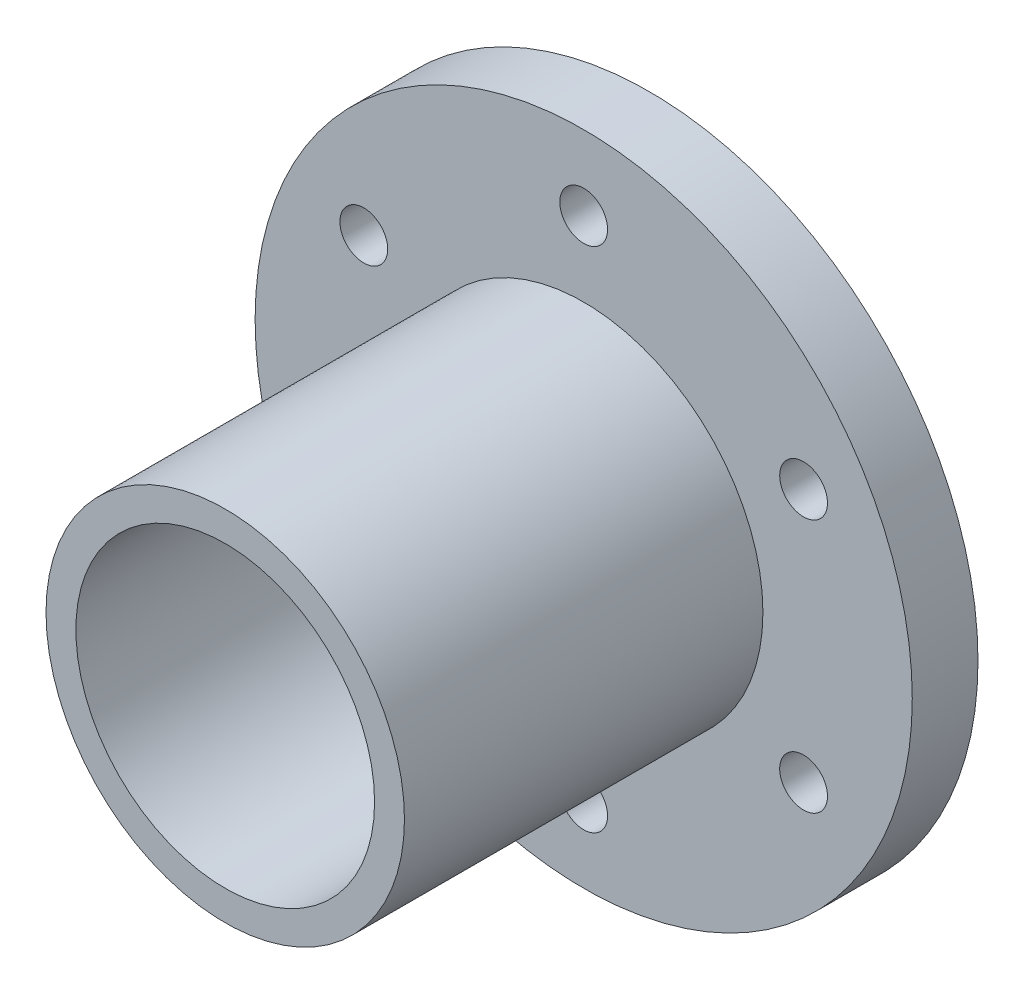
ISO-10303-21;
HEADER;
FILE_DESCRIPTION(('STEP AP214'),'2;1');
FILE_NAME('part.step','',(''),(''),'','','');
FILE_SCHEMA(('AUTOMOTIVE_DESIGN { 1 0 10303 214 1 1 1 1 }'));
ENDSEC;
DATA;
#1=APPLICATION_CONTEXT('core data for automotive mechanical design processes');
#2=APPLICATION_PROTOCOL_DEFINITION('international standard','automotive_design',2000,#1);
#3=PRODUCT_CONTEXT('',#1,'mechanical');
#4=PRODUCT('Part','Part','',(#3));
#5=PRODUCT_RELATED_PRODUCT_CATEGORY('part','',(#4));
#6=PRODUCT_DEFINITION_FORMATION('','',#4);
#7=PRODUCT_DEFINITION_CONTEXT('part definition',#1,'design');
#8=PRODUCT_DEFINITION('design','',#6,#7);
#9=PRODUCT_DEFINITION_SHAPE('','',#8);
#10=(LENGTH_UNIT() NAMED_UNIT(*) SI_UNIT(.MILLI.,.METRE.));
#11=(NAMED_UNIT(*) PLANE_ANGLE_UNIT() SI_UNIT($,.RADIAN.));
#12=(NAMED_UNIT(*) SI_UNIT($,.STERADIAN.) SOLID_ANGLE_UNIT());
#13=UNCERTAINTY_MEASURE_WITH_UNIT(LENGTH_MEASURE(1.E-05),#10,'distance_accuracy_value','');
#14=(GEOMETRIC_REPRESENTATION_CONTEXT(3) GLOBAL_UNCERTAINTY_ASSIGNED_CONTEXT((#13)) GLOBAL_UNIT_ASSIGNED_CONTEXT((#10,
#11,#12)) REPRESENTATION_CONTEXT('',''));
#15=CARTESIAN_POINT('',(0.,0.,0.));
#16=DIRECTION('',(0.,0.,1.));
#17=DIRECTION('',(1.,0.,0.));
#18=AXIS2_PLACEMENT_3D('',#15,#16,#17);
#19=CARTESIAN_POINT('',(0.,0.,22.));
#20=DIRECTION('',(0.,0.,-1.));
#21=DIRECTION('',(-1.,0.,0.));
#22=AXIS2_PLACEMENT_3D('',#19,#20,#21);
#23=CYLINDRICAL_SURFACE('',#22,110.);
#24=CARTESIAN_POINT('',(0.,0.,22.));
#25=DIRECTION('',(0.,0.,1.));
#26=DIRECTION('',(1.,0.,0.));
#27=AXIS2_PLACEMENT_3D('',#24,#25,#26);
#28=CIRCLE('',#27,110.);
#29=CARTESIAN_POINT('',(110.,0.,22.));
#30=VERTEX_POINT('',#29);
#31=EDGE_CURVE('E50',#30,#30,#28,.T.);
#32=ORIENTED_EDGE('',*,*,#31,.F.);
#33=EDGE_LOOP('',(#32));
#34=FACE_BOUND('',#33,.T.);
#35=CARTESIAN_POINT('',(0.,0.,0.));
#36=DIRECTION('',(0.,0.,1.));
#37=DIRECTION('',(1.,0.,0.));
#38=AXIS2_PLACEMENT_3D('',#35,#36,#37);
#39=CIRCLE('',#38,110.);
#40=CARTESIAN_POINT('',(110.,0.,0.));
#41=VERTEX_POINT('',#40);
#42=EDGE_CURVE('E56',#41,#41,#39,.T.);
#43=ORIENTED_EDGE('',*,*,#42,.T.);
#44=EDGE_LOOP('',(#43));
#45=FACE_BOUND('',#44,.T.);
#46=ADVANCED_FACE('F42',(#34,#45),#23,.T.);
#47=CARTESIAN_POINT('',(0.,0.,22.));
#48=DIRECTION('',(0.,0.,1.));
#49=DIRECTION('',(1.,0.,0.));
#50=AXIS2_PLACEMENT_3D('',#47,#48,#49);
#51=PLANE('',#50);
#52=CARTESIAN_POINT('',(73.6121593216768,42.5000000000009,22.));
#53=DIRECTION('',(0.,0.,1.));
#54=DIRECTION('',(0.50000000000001,-0.866025403784433,0.));
#55=AXIS2_PLACEMENT_3D('',#52,#53,#54);
#56=CIRCLE('',#55,8.);
#57=CARTESIAN_POINT('',(77.6121593216769,35.5717967697254,22.));
#58=VERTEX_POINT('',#57);
#59=EDGE_CURVE('E96',#58,#58,#56,.T.);
#60=ORIENTED_EDGE('',*,*,#59,.F.);
#61=EDGE_LOOP('',(#60));
#62=FACE_BOUND('',#61,.T.);
#63=CARTESIAN_POINT('',(73.6121593216777,-42.4999999999993,22.));
#64=DIRECTION('',(0.,0.,1.));
#65=DIRECTION('',(-0.499999999999992,-0.866025403784443,0.));
#66=AXIS2_PLACEMENT_3D('',#63,#64,#65);
#67=CIRCLE('',#66,8.);
#68=CARTESIAN_POINT('',(69.6121593216778,-49.4282032302749,22.));
#69=VERTEX_POINT('',#68);
#70=EDGE_CURVE('E104',#69,#69,#67,.T.);
#71=ORIENTED_EDGE('',*,*,#70,.F.);
#72=EDGE_LOOP('',(#71));
#73=FACE_BOUND('',#72,.T.);
#74=CARTESIAN_POINT('',(0.,-85.,22.));
#75=DIRECTION('',(0.,0.,1.));
#76=DIRECTION('',(-1.,0.,0.));
#77=AXIS2_PLACEMENT_3D('',#74,#75,#76);
#78=CIRCLE('',#77,8.);
#79=CARTESIAN_POINT('',(-8.,-85.,22.));
#80=VERTEX_POINT('',#79);
#81=EDGE_CURVE('E112',#80,#80,#78,.T.);
#82=ORIENTED_EDGE('',*,*,#81,.F.);
#83=EDGE_LOOP('',(#82));
#84=FACE_BOUND('',#83,.T.);
#85=CARTESIAN_POINT('',(-73.6121593216771,-42.5000000000003,22.));
#86=DIRECTION('',(0.,0.,1.));
#87=DIRECTION('',(-0.500000000000004,0.866025403784436,0.));
#88=AXIS2_PLACEMENT_3D('',#85,#86,#87);
#89=CIRCLE('',#88,8.);
#90=CARTESIAN_POINT('',(-77.6121593216771,-35.5717967697249,22.));
#91=VERTEX_POINT('',#90);
#92=EDGE_CURVE('E120',#91,#91,#89,.T.);
#93=ORIENTED_EDGE('',*,*,#92,.F.);
#94=EDGE_LOOP('',(#93));
#95=FACE_BOUND('',#94,.T.);
#96=CARTESIAN_POINT('',(-73.6121593216774,42.4999999999998,22.));
#97=DIRECTION('',(0.,0.,1.));
#98=DIRECTION('',(0.499999999999998,0.86602540378444,0.));
#99=AXIS2_PLACEMENT_3D('',#96,#97,#98);
#100=CIRCLE('',#99,8.);
#101=CARTESIAN_POINT('',(-69.6121593216774,49.4282032302754,22.));
#102=VERTEX_POINT('',#101);
#103=EDGE_CURVE('E88',#102,#102,#100,.T.);
#104=ORIENTED_EDGE('',*,*,#103,.F.);
#105=EDGE_LOOP('',(#104));
#106=FACE_BOUND('',#105,.T.);
#107=CARTESIAN_POINT('',(0.,85.,22.));
#108=DIRECTION('',(0.,0.,1.));
#109=DIRECTION('',(1.,0.,0.));
#110=AXIS2_PLACEMENT_3D('',#107,#108,#109);
#111=CIRCLE('',#110,8.);
#112=CARTESIAN_POINT('',(8.,85.,22.));
#113=VERTEX_POINT('',#112);
#114=EDGE_CURVE('E81',#113,#113,#111,.T.);
#115=ORIENTED_EDGE('',*,*,#114,.F.);
#116=EDGE_LOOP('',(#115));
#117=FACE_BOUND('',#116,.T.);
#118=CARTESIAN_POINT('',(0.,0.,22.));
#119=DIRECTION('',(0.,0.,1.));
#120=DIRECTION('',(1.,0.,0.));
#121=AXIS2_PLACEMENT_3D('',#118,#119,#120);
#122=CIRCLE('',#121,60.);
#123=CARTESIAN_POINT('',(60.,0.,22.));
#124=VERTEX_POINT('',#123);
#125=EDGE_CURVE('E10',#124,#124,#122,.T.);
#126=ORIENTED_EDGE('',*,*,#125,.F.);
#127=EDGE_LOOP('',(#126));
#128=FACE_BOUND('',#127,.T.);
#129=ORIENTED_EDGE('',*,*,#31,.T.);
#130=EDGE_LOOP('',(#129));
#131=FACE_BOUND('',#130,.T.);
#132=ADVANCED_FACE('F139',(#62,#73,#84,#95,#106,#117,#128,#131),#51,.T.);
#133=CARTESIAN_POINT('',(0.,0.,0.));
#134=DIRECTION('',(0.,0.,1.));
#135=DIRECTION('',(1.,0.,0.));
#136=AXIS2_PLACEMENT_3D('',#133,#134,#135);
#137=PLANE('',#136);
#138=CARTESIAN_POINT('',(73.6121593216768,42.5000000000009,0.));
#139=DIRECTION('',(0.,0.,1.));
#140=DIRECTION('',(0.50000000000001,-0.866025403784433,0.));
#141=AXIS2_PLACEMENT_3D('',#138,#139,#140);
#142=CIRCLE('',#141,8.);
#143=CARTESIAN_POINT('',(77.6121593216769,35.5717967697254,0.));
#144=VERTEX_POINT('',#143);
#145=EDGE_CURVE('E100',#144,#144,#142,.T.);
#146=ORIENTED_EDGE('',*,*,#145,.T.);
#147=EDGE_LOOP('',(#146));
#148=FACE_BOUND('',#147,.T.);
#149=CARTESIAN_POINT('',(73.6121593216777,-42.4999999999993,0.));
#150=DIRECTION('',(0.,0.,1.));
#151=DIRECTION('',(-0.499999999999992,-0.866025403784443,0.));
#152=AXIS2_PLACEMENT_3D('',#149,#150,#151);
#153=CIRCLE('',#152,8.);
#154=CARTESIAN_POINT('',(69.6121593216778,-49.4282032302749,0.));
#155=VERTEX_POINT('',#154);
#156=EDGE_CURVE('E108',#155,#155,#153,.T.);
#157=ORIENTED_EDGE('',*,*,#156,.T.);
#158=EDGE_LOOP('',(#157));
#159=FACE_BOUND('',#158,.T.);
#160=CARTESIAN_POINT('',(0.,-85.,0.));
#161=DIRECTION('',(0.,0.,1.));
#162=DIRECTION('',(-1.,0.,0.));
#163=AXIS2_PLACEMENT_3D('',#160,#161,#162);
#164=CIRCLE('',#163,8.);
#165=CARTESIAN_POINT('',(-8.,-85.,0.));
#166=VERTEX_POINT('',#165);
#167=EDGE_CURVE('E116',#166,#166,#164,.T.);
#168=ORIENTED_EDGE('',*,*,#167,.T.);
#169=EDGE_LOOP('',(#168));
#170=FACE_BOUND('',#169,.T.);
#171=CARTESIAN_POINT('',(-73.6121593216771,-42.5000000000003,0.));
#172=DIRECTION('',(0.,0.,1.));
#173=DIRECTION('',(-0.500000000000004,0.866025403784436,0.));
#174=AXIS2_PLACEMENT_3D('',#171,#172,#173);
#175=CIRCLE('',#174,8.);
#176=CARTESIAN_POINT('',(-77.6121593216771,-35.5717967697249,0.));
#177=VERTEX_POINT('',#176);
#178=EDGE_CURVE('E92',#177,#177,#175,.T.);
#179=ORIENTED_EDGE('',*,*,#178,.T.);
#180=EDGE_LOOP('',(#179));
#181=FACE_BOUND('',#180,.T.);
#182=CARTESIAN_POINT('',(-73.6121593216774,42.4999999999998,0.));
#183=DIRECTION('',(0.,0.,1.));
#184=DIRECTION('',(0.499999999999998,0.86602540378444,0.));
#185=AXIS2_PLACEMENT_3D('',#182,#183,#184);
#186=CIRCLE('',#185,8.);
#187=CARTESIAN_POINT('',(-69.6121593216774,49.4282032302754,0.));
#188=VERTEX_POINT('',#187);
#189=EDGE_CURVE('E86',#188,#188,#186,.T.);
#190=ORIENTED_EDGE('',*,*,#189,.T.);
#191=EDGE_LOOP('',(#190));
#192=FACE_BOUND('',#191,.T.);
#193=CARTESIAN_POINT('',(0.,85.,0.));
#194=DIRECTION('',(0.,0.,1.));
#195=DIRECTION('',(1.,0.,0.));
#196=AXIS2_PLACEMENT_3D('',#193,#194,#195);
#197=CIRCLE('',#196,8.);
#198=CARTESIAN_POINT('',(8.,85.,0.));
#199=VERTEX_POINT('',#198);
#200=EDGE_CURVE('E76',#199,#199,#197,.T.);
#201=ORIENTED_EDGE('',*,*,#200,.T.);
#202=EDGE_LOOP('',(#201));
#203=FACE_BOUND('',#202,.T.);
#204=CARTESIAN_POINT('',(0.,0.,0.));
#205=DIRECTION('',(0.,0.,1.));
#206=DIRECTION('',(1.,0.,0.));
#207=AXIS2_PLACEMENT_3D('',#204,#205,#206);
#208=CIRCLE('',#207,50.);
#209=CARTESIAN_POINT('',(50.,0.,0.));
#210=VERTEX_POINT('',#209);
#211=EDGE_CURVE('E71',#210,#210,#208,.T.);
#212=ORIENTED_EDGE('',*,*,#211,.T.);
#213=EDGE_LOOP('',(#212));
#214=FACE_BOUND('',#213,.T.);
#215=ORIENTED_EDGE('',*,*,#42,.F.);
#216=EDGE_LOOP('',(#215));
#217=FACE_BOUND('',#216,.T.);
#218=ADVANCED_FACE('F128',(#148,#159,#170,#181,#192,#203,#214,#217),#137,.F.);
#219=CARTESIAN_POINT('',(0.,0.,142.));
#220=DIRECTION('',(0.,0.,-1.));
#221=DIRECTION('',(-1.,0.,0.));
#222=AXIS2_PLACEMENT_3D('',#219,#220,#221);
#223=CYLINDRICAL_SURFACE('',#222,60.);
#224=CARTESIAN_POINT('',(0.,0.,142.));
#225=DIRECTION('',(0.,0.,1.));
#226=DIRECTION('',(1.,0.,0.));
#227=AXIS2_PLACEMENT_3D('',#224,#225,#226);
#228=CIRCLE('',#227,60.);
#229=CARTESIAN_POINT('',(60.,0.,142.));
#230=VERTEX_POINT('',#229);
#231=EDGE_CURVE('E59',#230,#230,#228,.T.);
#232=ORIENTED_EDGE('',*,*,#231,.F.);
#233=EDGE_LOOP('',(#232));
#234=FACE_BOUND('',#233,.T.);
#235=ORIENTED_EDGE('',*,*,#125,.T.);
#236=EDGE_LOOP('',(#235));
#237=FACE_BOUND('',#236,.T.);
#238=ADVANCED_FACE('F166',(#234,#237),#223,.T.);
#239=CARTESIAN_POINT('',(0.,0.,142.));
#240=DIRECTION('',(0.,0.,1.));
#241=DIRECTION('',(1.,0.,0.));
#242=AXIS2_PLACEMENT_3D('',#239,#240,#241);
#243=PLANE('',#242);
#244=CARTESIAN_POINT('',(0.,0.,142.));
#245=DIRECTION('',(0.,0.,1.));
#246=DIRECTION('',(1.,0.,0.));
#247=AXIS2_PLACEMENT_3D('',#244,#245,#246);
#248=CIRCLE('',#247,50.);
#249=CARTESIAN_POINT('',(50.,0.,142.));
#250=VERTEX_POINT('',#249);
#251=EDGE_CURVE('E45',#250,#250,#248,.T.);
#252=ORIENTED_EDGE('',*,*,#251,.F.);
#253=EDGE_LOOP('',(#252));
#254=FACE_BOUND('',#253,.T.);
#255=ORIENTED_EDGE('',*,*,#231,.T.);
#256=EDGE_LOOP('',(#255));
#257=FACE_BOUND('',#256,.T.);
#258=ADVANCED_FACE('F173',(#254,#257),#243,.T.);
#259=CARTESIAN_POINT('',(0.,0.,0.));
#260=DIRECTION('',(0.,0.,1.));
#261=DIRECTION('',(1.,0.,0.));
#262=AXIS2_PLACEMENT_3D('',#259,#260,#261);
#263=CYLINDRICAL_SURFACE('',#262,50.);
#264=ORIENTED_EDGE('',*,*,#251,.T.);
#265=EDGE_LOOP('',(#264));
#266=FACE_BOUND('',#265,.T.);
#267=ORIENTED_EDGE('',*,*,#211,.F.);
#268=EDGE_LOOP('',(#267));
#269=FACE_BOUND('',#268,.T.);
#270=ADVANCED_FACE('F181',(#266,#269),#263,.F.);
#271=CARTESIAN_POINT('',(0.,85.,0.));
#272=DIRECTION('',(0.,0.,1.));
#273=DIRECTION('',(1.,0.,0.));
#274=AXIS2_PLACEMENT_3D('',#271,#272,#273);
#275=CYLINDRICAL_SURFACE('',#274,8.);
#276=ORIENTED_EDGE('',*,*,#200,.F.);
#277=EDGE_LOOP('',(#276));
#278=FACE_BOUND('',#277,.T.);
#279=ORIENTED_EDGE('',*,*,#114,.T.);
#280=EDGE_LOOP('',(#279));
#281=FACE_BOUND('',#280,.T.);
#282=ADVANCED_FACE('F189',(#278,#281),#275,.F.);
#283=CARTESIAN_POINT('',(-73.6121593216774,42.4999999999998,0.));
#284=DIRECTION('',(0.,0.,1.));
#285=DIRECTION('',(1.,0.,0.));
#286=AXIS2_PLACEMENT_3D('',#283,#284,#285);
#287=CYLINDRICAL_SURFACE('',#286,8.);
#288=ORIENTED_EDGE('',*,*,#189,.F.);
#289=EDGE_LOOP('',(#288));
#290=FACE_BOUND('',#289,.T.);
#291=ORIENTED_EDGE('',*,*,#103,.T.);
#292=EDGE_LOOP('',(#291));
#293=FACE_BOUND('',#292,.T.);
#294=ADVANCED_FACE('F135',(#290,#293),#287,.F.);
#295=CARTESIAN_POINT('',(-73.6121593216771,-42.5000000000003,0.));
#296=DIRECTION('',(0.,0.,1.));
#297=DIRECTION('',(1.,0.,0.));
#298=AXIS2_PLACEMENT_3D('',#295,#296,#297);
#299=CYLINDRICAL_SURFACE('',#298,8.);
#300=ORIENTED_EDGE('',*,*,#178,.F.);
#301=EDGE_LOOP('',(#300));
#302=FACE_BOUND('',#301,.T.);
#303=ORIENTED_EDGE('',*,*,#92,.T.);
#304=EDGE_LOOP('',(#303));
#305=FACE_BOUND('',#304,.T.);
#306=ADVANCED_FACE('F131',(#302,#305),#299,.F.);
#307=CARTESIAN_POINT('',(0.,-85.,0.));
#308=DIRECTION('',(0.,0.,1.));
#309=DIRECTION('',(1.,0.,0.));
#310=AXIS2_PLACEMENT_3D('',#307,#308,#309);
#311=CYLINDRICAL_SURFACE('',#310,8.);
#312=ORIENTED_EDGE('',*,*,#167,.F.);
#313=EDGE_LOOP('',(#312));
#314=FACE_BOUND('',#313,.T.);
#315=ORIENTED_EDGE('',*,*,#81,.T.);
#316=EDGE_LOOP('',(#315));
#317=FACE_BOUND('',#316,.T.);
#318=ADVANCED_FACE('F134',(#314,#317),#311,.F.);
#319=CARTESIAN_POINT('',(73.6121593216777,-42.4999999999993,0.));
#320=DIRECTION('',(0.,0.,1.));
#321=DIRECTION('',(1.,0.,0.));
#322=AXIS2_PLACEMENT_3D('',#319,#320,#321);
#323=CYLINDRICAL_SURFACE('',#322,8.);
#324=ORIENTED_EDGE('',*,*,#156,.F.);
#325=EDGE_LOOP('',(#324));
#326=FACE_BOUND('',#325,.T.);
#327=ORIENTED_EDGE('',*,*,#70,.T.);
#328=EDGE_LOOP('',(#327));
#329=FACE_BOUND('',#328,.T.);
#330=ADVANCED_FACE('F213',(#326,#329),#323,.F.);
#331=CARTESIAN_POINT('',(73.6121593216768,42.5000000000009,0.));
#332=DIRECTION('',(0.,0.,1.));
#333=DIRECTION('',(1.,0.,0.));
#334=AXIS2_PLACEMENT_3D('',#331,#332,#333);
#335=CYLINDRICAL_SURFACE('',#334,8.);
#336=ORIENTED_EDGE('',*,*,#145,.F.);
#337=EDGE_LOOP('',(#336));
#338=FACE_BOUND('',#337,.T.);
#339=ORIENTED_EDGE('',*,*,#59,.T.);
#340=EDGE_LOOP('',(#339));
#341=FACE_BOUND('',#340,.T.);
#342=ADVANCED_FACE('F221',(#338,#341),#335,.F.);
#343=CLOSED_SHELL('',(#46,#132,#218,#238,#258,#270,#282,#294,#306,#318,#330,#342));
#344=MANIFOLD_SOLID_BREP('B2',#343);
#345=ADVANCED_BREP_SHAPE_REPRESENTATION('',(#18,#344),#14);
#346=SHAPE_DEFINITION_REPRESENTATION(#9,#345);
ENDSEC;
END-ISO-10303-21;
